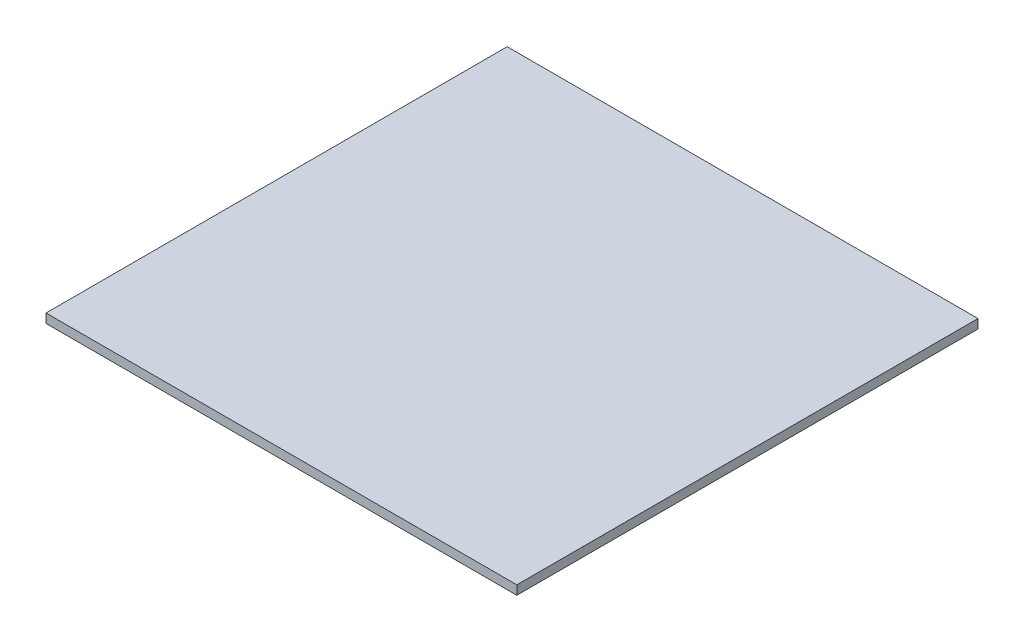
ISO-10303-21;
HEADER;
FILE_DESCRIPTION(('STEP AP214'),'2;1');
FILE_NAME('part.step','',(''),(''),'','','');
FILE_SCHEMA(('AUTOMOTIVE_DESIGN { 1 0 10303 214 1 1 1 1 }'));
ENDSEC;
DATA;
#1=APPLICATION_CONTEXT('core data for automotive mechanical design processes');
#2=APPLICATION_PROTOCOL_DEFINITION('international standard','automotive_design',2000,#1);
#3=PRODUCT_CONTEXT('',#1,'mechanical');
#4=PRODUCT('Part','Part','',(#3));
#5=PRODUCT_RELATED_PRODUCT_CATEGORY('part','',(#4));
#6=PRODUCT_DEFINITION_FORMATION('','',#4);
#7=PRODUCT_DEFINITION_CONTEXT('part definition',#1,'design');
#8=PRODUCT_DEFINITION('design','',#6,#7);
#9=PRODUCT_DEFINITION_SHAPE('','',#8);
#10=(LENGTH_UNIT() NAMED_UNIT(*) SI_UNIT(.MILLI.,.METRE.));
#11=(NAMED_UNIT(*) PLANE_ANGLE_UNIT() SI_UNIT($,.RADIAN.));
#12=(NAMED_UNIT(*) SI_UNIT($,.STERADIAN.) SOLID_ANGLE_UNIT());
#13=UNCERTAINTY_MEASURE_WITH_UNIT(LENGTH_MEASURE(1.E-05),#10,'distance_accuracy_value','');
#14=(GEOMETRIC_REPRESENTATION_CONTEXT(3) GLOBAL_UNCERTAINTY_ASSIGNED_CONTEXT((#13)) GLOBAL_UNIT_ASSIGNED_CONTEXT((#10,
#11,#12)) REPRESENTATION_CONTEXT('',''));
#15=CARTESIAN_POINT('',(0.,0.,0.));
#16=DIRECTION('',(0.,0.,1.));
#17=DIRECTION('',(1.,0.,0.));
#18=AXIS2_PLACEMENT_3D('',#15,#16,#17);
#19=CARTESIAN_POINT('',(0.,6.,-304.8));
#20=DIRECTION('',(0.,0.,-1.));
#21=DIRECTION('',(-1.,0.,0.));
#22=AXIS2_PLACEMENT_3D('',#19,#20,#21);
#23=PLANE('',#22);
#24=DIRECTION('',(1.,0.,0.));
#25=VECTOR('',#24,1.);
#26=CARTESIAN_POINT('',(0.,0.,-304.8));
#27=LINE('',#26,#25);
#28=CARTESIAN_POINT('',(0.,0.,-304.8));
#29=VERTEX_POINT('',#28);
#30=CARTESIAN_POINT('',(311.15,0.,-304.8));
#31=VERTEX_POINT('',#30);
#32=EDGE_CURVE('E107',#29,#31,#27,.T.);
#33=ORIENTED_EDGE('',*,*,#32,.F.);
#34=DIRECTION('',(0.,-1.,0.));
#35=VECTOR('',#34,1.);
#36=CARTESIAN_POINT('',(0.,6.,-304.8));
#37=LINE('',#36,#35);
#38=CARTESIAN_POINT('',(0.,6.,-304.8));
#39=VERTEX_POINT('',#38);
#40=EDGE_CURVE('E11',#39,#29,#37,.T.);
#41=ORIENTED_EDGE('',*,*,#40,.F.);
#42=DIRECTION('',(1.,0.,0.));
#43=VECTOR('',#42,1.);
#44=CARTESIAN_POINT('',(0.,6.,-304.8));
#45=LINE('',#44,#43);
#46=CARTESIAN_POINT('',(311.15,6.,-304.8));
#47=VERTEX_POINT('',#46);
#48=EDGE_CURVE('E101',#39,#47,#45,.T.);
#49=ORIENTED_EDGE('',*,*,#48,.T.);
#50=DIRECTION('',(0.,-1.,0.));
#51=VECTOR('',#50,1.);
#52=CARTESIAN_POINT('',(311.15,6.,-304.8));
#53=LINE('',#52,#51);
#54=EDGE_CURVE('E46',#47,#31,#53,.T.);
#55=ORIENTED_EDGE('',*,*,#54,.T.);
#56=EDGE_LOOP('',(#33,#41,#49,#55));
#57=FACE_BOUND('',#56,.T.);
#58=ADVANCED_FACE('F43',(#57),#23,.T.);
#59=CARTESIAN_POINT('',(0.,6.,0.));
#60=DIRECTION('',(-1.,0.,0.));
#61=DIRECTION('',(0.,0.,1.));
#62=AXIS2_PLACEMENT_3D('',#59,#60,#61);
#63=PLANE('',#62);
#64=DIRECTION('',(0.,0.,-1.));
#65=VECTOR('',#64,1.);
#66=CARTESIAN_POINT('',(0.,0.,0.));
#67=LINE('',#66,#65);
#68=CARTESIAN_POINT('',(0.,0.,0.));
#69=VERTEX_POINT('',#68);
#70=EDGE_CURVE('E103',#69,#29,#67,.T.);
#71=ORIENTED_EDGE('',*,*,#70,.F.);
#72=DIRECTION('',(0.,-1.,0.));
#73=VECTOR('',#72,1.);
#74=CARTESIAN_POINT('',(0.,6.,0.));
#75=LINE('',#74,#73);
#76=CARTESIAN_POINT('',(0.,6.,0.));
#77=VERTEX_POINT('',#76);
#78=EDGE_CURVE('E52',#77,#69,#75,.T.);
#79=ORIENTED_EDGE('',*,*,#78,.F.);
#80=DIRECTION('',(0.,0.,-1.));
#81=VECTOR('',#80,1.);
#82=CARTESIAN_POINT('',(0.,6.,0.));
#83=LINE('',#82,#81);
#84=EDGE_CURVE('E91',#77,#39,#83,.T.);
#85=ORIENTED_EDGE('',*,*,#84,.T.);
#86=ORIENTED_EDGE('',*,*,#40,.T.);
#87=EDGE_LOOP('',(#71,#79,#85,#86));
#88=FACE_BOUND('',#87,.T.);
#89=ADVANCED_FACE('F117',(#88),#63,.T.);
#90=CARTESIAN_POINT('',(0.,6.,0.));
#91=DIRECTION('',(0.,0.,-1.));
#92=DIRECTION('',(-1.,0.,0.));
#93=AXIS2_PLACEMENT_3D('',#90,#91,#92);
#94=PLANE('',#93);
#95=DIRECTION('',(1.,0.,0.));
#96=VECTOR('',#95,1.);
#97=CARTESIAN_POINT('',(0.,0.,0.));
#98=LINE('',#97,#96);
#99=CARTESIAN_POINT('',(311.15,0.,0.));
#100=VERTEX_POINT('',#99);
#101=EDGE_CURVE('E96',#69,#100,#98,.T.);
#102=ORIENTED_EDGE('',*,*,#101,.T.);
#103=DIRECTION('',(0.,-1.,0.));
#104=VECTOR('',#103,1.);
#105=CARTESIAN_POINT('',(311.15,6.,0.));
#106=LINE('',#105,#104);
#107=CARTESIAN_POINT('',(311.15,6.,0.));
#108=VERTEX_POINT('',#107);
#109=EDGE_CURVE('E94',#108,#100,#106,.T.);
#110=ORIENTED_EDGE('',*,*,#109,.F.);
#111=DIRECTION('',(1.,0.,0.));
#112=VECTOR('',#111,1.);
#113=CARTESIAN_POINT('',(0.,6.,0.));
#114=LINE('',#113,#112);
#115=EDGE_CURVE('E88',#77,#108,#114,.T.);
#116=ORIENTED_EDGE('',*,*,#115,.F.);
#117=ORIENTED_EDGE('',*,*,#78,.T.);
#118=EDGE_LOOP('',(#102,#110,#116,#117));
#119=FACE_BOUND('',#118,.T.);
#120=ADVANCED_FACE('F95',(#119),#94,.F.);
#121=CARTESIAN_POINT('',(311.15,6.,0.));
#122=DIRECTION('',(-1.,0.,0.));
#123=DIRECTION('',(0.,0.,1.));
#124=AXIS2_PLACEMENT_3D('',#121,#122,#123);
#125=PLANE('',#124);
#126=DIRECTION('',(0.,0.,-1.));
#127=VECTOR('',#126,1.);
#128=CARTESIAN_POINT('',(311.15,0.,0.));
#129=LINE('',#128,#127);
#130=EDGE_CURVE('E110',#100,#31,#129,.T.);
#131=ORIENTED_EDGE('',*,*,#130,.T.);
#132=ORIENTED_EDGE('',*,*,#54,.F.);
#133=DIRECTION('',(0.,0.,-1.));
#134=VECTOR('',#133,1.);
#135=CARTESIAN_POINT('',(311.15,6.,0.));
#136=LINE('',#135,#134);
#137=EDGE_CURVE('E85',#108,#47,#136,.T.);
#138=ORIENTED_EDGE('',*,*,#137,.F.);
#139=ORIENTED_EDGE('',*,*,#109,.T.);
#140=EDGE_LOOP('',(#131,#132,#138,#139));
#141=FACE_BOUND('',#140,.T.);
#142=ADVANCED_FACE('F100',(#141),#125,.F.);
#143=CARTESIAN_POINT('',(0.,6.,0.));
#144=DIRECTION('',(0.,1.,0.));
#145=DIRECTION('',(0.,0.,1.));
#146=AXIS2_PLACEMENT_3D('',#143,#144,#145);
#147=PLANE('',#146);
#148=ORIENTED_EDGE('',*,*,#48,.F.);
#149=ORIENTED_EDGE('',*,*,#84,.F.);
#150=ORIENTED_EDGE('',*,*,#115,.T.);
#151=ORIENTED_EDGE('',*,*,#137,.T.);
#152=EDGE_LOOP('',(#148,#149,#150,#151));
#153=FACE_BOUND('',#152,.T.);
#154=ADVANCED_FACE('F90',(#153),#147,.T.);
#155=CARTESIAN_POINT('',(0.,0.,0.));
#156=DIRECTION('',(0.,1.,0.));
#157=DIRECTION('',(0.,0.,1.));
#158=AXIS2_PLACEMENT_3D('',#155,#156,#157);
#159=PLANE('',#158);
#160=ORIENTED_EDGE('',*,*,#32,.T.);
#161=ORIENTED_EDGE('',*,*,#130,.F.);
#162=ORIENTED_EDGE('',*,*,#101,.F.);
#163=ORIENTED_EDGE('',*,*,#70,.T.);
#164=EDGE_LOOP('',(#160,#161,#162,#163));
#165=FACE_BOUND('',#164,.T.);
#166=ADVANCED_FACE('F116',(#165),#159,.F.);
#167=CLOSED_SHELL('',(#58,#89,#120,#142,#154,#166));
#168=MANIFOLD_SOLID_BREP('B2',#167);
#169=ADVANCED_BREP_SHAPE_REPRESENTATION('',(#18,#168),#14);
#170=SHAPE_DEFINITION_REPRESENTATION(#9,#169);
ENDSEC;
END-ISO-10303-21;
